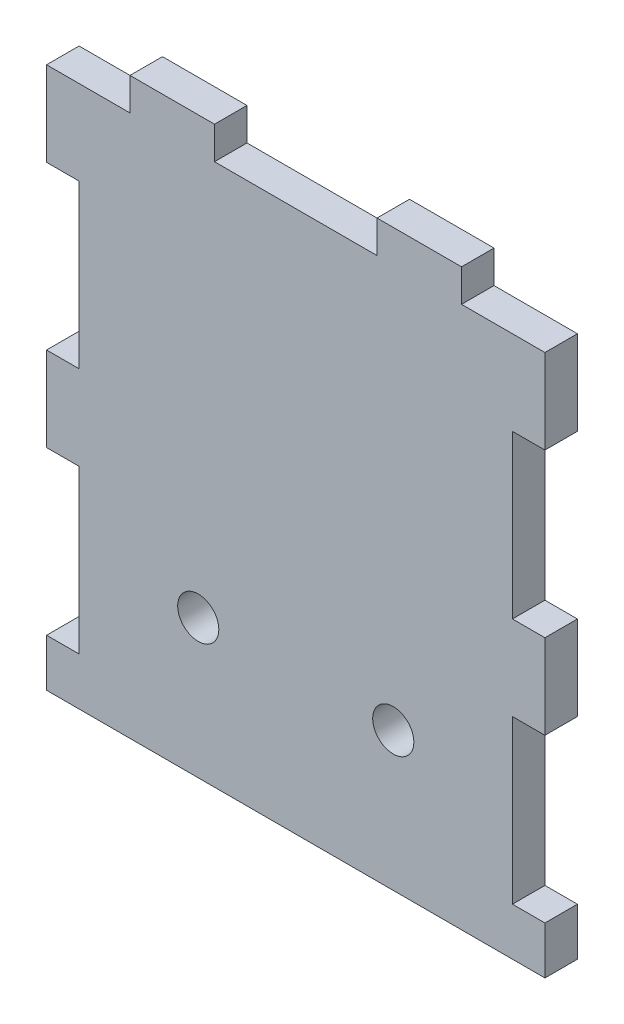
ISO-10303-21;
HEADER;
FILE_DESCRIPTION(('STEP AP214'),'2;1');
FILE_NAME('part.step','',(''),(''),'','','');
FILE_SCHEMA(('AUTOMOTIVE_DESIGN { 1 0 10303 214 1 1 1 1 }'));
ENDSEC;
DATA;
#1=APPLICATION_CONTEXT('core data for automotive mechanical design processes');
#2=APPLICATION_PROTOCOL_DEFINITION('international standard','automotive_design',2000,#1);
#3=PRODUCT_CONTEXT('',#1,'mechanical');
#4=PRODUCT('Part','Part','',(#3));
#5=PRODUCT_RELATED_PRODUCT_CATEGORY('part','',(#4));
#6=PRODUCT_DEFINITION_FORMATION('','',#4);
#7=PRODUCT_DEFINITION_CONTEXT('part definition',#1,'design');
#8=PRODUCT_DEFINITION('design','',#6,#7);
#9=PRODUCT_DEFINITION_SHAPE('','',#8);
#10=(LENGTH_UNIT() NAMED_UNIT(*) SI_UNIT(.MILLI.,.METRE.));
#11=(NAMED_UNIT(*) PLANE_ANGLE_UNIT() SI_UNIT($,.RADIAN.));
#12=(NAMED_UNIT(*) SI_UNIT($,.STERADIAN.) SOLID_ANGLE_UNIT());
#13=UNCERTAINTY_MEASURE_WITH_UNIT(LENGTH_MEASURE(1.E-05),#10,'distance_accuracy_value','');
#14=(GEOMETRIC_REPRESENTATION_CONTEXT(3) GLOBAL_UNCERTAINTY_ASSIGNED_CONTEXT((#13)) GLOBAL_UNIT_ASSIGNED_CONTEXT((#10,
#11,#12)) REPRESENTATION_CONTEXT('',''));
#15=CARTESIAN_POINT('',(0.,0.,0.));
#16=DIRECTION('',(0.,0.,1.));
#17=DIRECTION('',(1.,0.,0.));
#18=AXIS2_PLACEMENT_3D('',#15,#16,#17);
#19=CARTESIAN_POINT('',(-40.9934606481482,16.5420138888889,3.));
#20=DIRECTION('',(0.,-1.,0.));
#21=DIRECTION('',(0.,0.,-1.));
#22=AXIS2_PLACEMENT_3D('',#19,#20,#21);
#23=PLANE('',#22);
#24=DIRECTION('',(0.,0.,1.));
#25=VECTOR('',#24,1.);
#26=CARTESIAN_POINT('',(-10.4934606481481,16.5420138888889,0.));
#27=LINE('',#26,#25);
#28=CARTESIAN_POINT('',(-10.4934606481481,16.5420138888889,0.));
#29=VERTEX_POINT('',#28);
#30=CARTESIAN_POINT('',(-10.4934606481481,16.5420138888889,3.));
#31=VERTEX_POINT('',#30);
#32=EDGE_CURVE('E244',#29,#31,#27,.T.);
#33=ORIENTED_EDGE('',*,*,#32,.F.);
#34=DIRECTION('',(-1.,0.,0.));
#35=VECTOR('',#34,1.);
#36=CARTESIAN_POINT('',(-40.9934606481482,16.5420138888889,0.));
#37=LINE('',#36,#35);
#38=CARTESIAN_POINT('',(-25.4934606481481,16.5420138888889,0.));
#39=VERTEX_POINT('',#38);
#40=EDGE_CURVE('E413',#29,#39,#37,.T.);
#41=ORIENTED_EDGE('',*,*,#40,.T.);
#42=DIRECTION('',(0.,0.,-1.));
#43=VECTOR('',#42,1.);
#44=CARTESIAN_POINT('',(-25.4934606481481,16.5420138888889,0.));
#45=LINE('',#44,#43);
#46=CARTESIAN_POINT('',(-25.4934606481481,16.5420138888889,3.));
#47=VERTEX_POINT('',#46);
#48=EDGE_CURVE('E248',#47,#39,#45,.T.);
#49=ORIENTED_EDGE('',*,*,#48,.F.);
#50=DIRECTION('',(-1.,0.,0.));
#51=VECTOR('',#50,1.);
#52=CARTESIAN_POINT('',(-40.9934606481482,16.5420138888889,3.));
#53=LINE('',#52,#51);
#54=EDGE_CURVE('E50',#31,#47,#53,.T.);
#55=ORIENTED_EDGE('',*,*,#54,.F.);
#56=EDGE_LOOP('',(#33,#41,#49,#55));
#57=FACE_BOUND('',#56,.T.);
#58=ADVANCED_FACE('F35',(#57),#23,.F.);
#59=DIRECTION('',(0.,0.,-1.));
#60=VECTOR('',#59,1.);
#61=CARTESIAN_POINT('',(-2.69346064814815,16.5420138888889,0.));
#62=LINE('',#61,#60);
#63=CARTESIAN_POINT('',(-2.69346064814815,16.5420138888889,3.));
#64=VERTEX_POINT('',#63);
#65=CARTESIAN_POINT('',(-2.69346064814815,16.5420138888889,0.));
#66=VERTEX_POINT('',#65);
#67=EDGE_CURVE('E58',#64,#66,#62,.T.);
#68=ORIENTED_EDGE('',*,*,#67,.F.);
#69=CARTESIAN_POINT('',(5.00653935185185,16.5420138888889,3.));
#70=VERTEX_POINT('',#69);
#71=EDGE_CURVE('E396',#70,#64,#53,.T.);
#72=ORIENTED_EDGE('',*,*,#71,.F.);
#73=DIRECTION('',(0.,0.,-1.));
#74=VECTOR('',#73,1.);
#75=CARTESIAN_POINT('',(5.00653935185185,16.5420138888889,3.));
#76=LINE('',#75,#74);
#77=CARTESIAN_POINT('',(5.00653935185185,16.5420138888889,0.));
#78=VERTEX_POINT('',#77);
#79=EDGE_CURVE('E416',#70,#78,#76,.T.);
#80=ORIENTED_EDGE('',*,*,#79,.T.);
#81=EDGE_CURVE('E411',#78,#66,#37,.T.);
#82=ORIENTED_EDGE('',*,*,#81,.T.);
#83=EDGE_LOOP('',(#68,#72,#80,#82));
#84=FACE_BOUND('',#83,.T.);
#85=ADVANCED_FACE('F496',(#84),#23,.F.);
#86=DIRECTION('',(0.,0.,1.));
#87=VECTOR('',#86,1.);
#88=CARTESIAN_POINT('',(-33.2934606481481,16.5420138888889,0.));
#89=LINE('',#88,#87);
#90=CARTESIAN_POINT('',(-33.2934606481481,16.5420138888889,0.));
#91=VERTEX_POINT('',#90);
#92=CARTESIAN_POINT('',(-33.2934606481481,16.5420138888889,3.));
#93=VERTEX_POINT('',#92);
#94=EDGE_CURVE('E245',#91,#93,#89,.T.);
#95=ORIENTED_EDGE('',*,*,#94,.F.);
#96=CARTESIAN_POINT('',(-40.9934606481482,16.5420138888889,0.));
#97=VERTEX_POINT('',#96);
#98=EDGE_CURVE('E409',#91,#97,#37,.T.);
#99=ORIENTED_EDGE('',*,*,#98,.T.);
#100=DIRECTION('',(0.,0.,-1.));
#101=VECTOR('',#100,1.);
#102=CARTESIAN_POINT('',(-40.9934606481482,16.5420138888889,3.));
#103=LINE('',#102,#101);
#104=CARTESIAN_POINT('',(-40.9934606481482,16.5420138888889,3.));
#105=VERTEX_POINT('',#104);
#106=EDGE_CURVE('E398',#105,#97,#103,.T.);
#107=ORIENTED_EDGE('',*,*,#106,.F.);
#108=EDGE_CURVE('E394',#93,#105,#53,.T.);
#109=ORIENTED_EDGE('',*,*,#108,.F.);
#110=EDGE_LOOP('',(#95,#99,#107,#109));
#111=FACE_BOUND('',#110,.T.);
#112=ADVANCED_FACE('F469',(#111),#23,.F.);
#113=CARTESIAN_POINT('',(5.00653935185185,16.5420138888889,3.));
#114=DIRECTION('',(-1.,0.,0.));
#115=DIRECTION('',(0.,-1.,0.));
#116=AXIS2_PLACEMENT_3D('',#113,#114,#115);
#117=PLANE('',#116);
#118=DIRECTION('',(0.,1.,0.));
#119=VECTOR('',#118,1.);
#120=CARTESIAN_POINT('',(5.00653935185185,16.5420138888889,0.));
#121=LINE('',#120,#119);
#122=CARTESIAN_POINT('',(5.00653935185186,-33.4579861111111,0.));
#123=VERTEX_POINT('',#122);
#124=CARTESIAN_POINT('',(5.00653935185185,-29.0579861111111,0.));
#125=VERTEX_POINT('',#124);
#126=EDGE_CURVE('E406',#123,#125,#121,.T.);
#127=ORIENTED_EDGE('',*,*,#126,.T.);
#128=DIRECTION('',(0.,0.,1.));
#129=VECTOR('',#128,1.);
#130=CARTESIAN_POINT('',(5.00653935185185,-29.0579861111111,0.));
#131=LINE('',#130,#129);
#132=CARTESIAN_POINT('',(5.00653935185185,-29.0579861111111,3.));
#133=VERTEX_POINT('',#132);
#134=EDGE_CURVE('E295',#125,#133,#131,.T.);
#135=ORIENTED_EDGE('',*,*,#134,.T.);
#136=DIRECTION('',(0.,1.,0.));
#137=VECTOR('',#136,1.);
#138=CARTESIAN_POINT('',(5.00653935185185,16.5420138888889,3.));
#139=LINE('',#138,#137);
#140=CARTESIAN_POINT('',(5.00653935185186,-33.4579861111111,3.));
#141=VERTEX_POINT('',#140);
#142=EDGE_CURVE('E391',#141,#133,#139,.T.);
#143=ORIENTED_EDGE('',*,*,#142,.F.);
#144=DIRECTION('',(0.,0.,-1.));
#145=VECTOR('',#144,1.);
#146=CARTESIAN_POINT('',(5.00653935185186,-33.4579861111111,3.));
#147=LINE('',#146,#145);
#148=EDGE_CURVE('E43',#141,#123,#147,.T.);
#149=ORIENTED_EDGE('',*,*,#148,.T.);
#150=EDGE_LOOP('',(#127,#135,#143,#149));
#151=FACE_BOUND('',#150,.T.);
#152=ADVANCED_FACE('F423',(#151),#117,.F.);
#153=CARTESIAN_POINT('',(-40.9934606481482,16.5420138888889,3.));
#154=DIRECTION('',(1.,0.,0.));
#155=DIRECTION('',(0.,0.,-1.));
#156=AXIS2_PLACEMENT_3D('',#153,#154,#155);
#157=PLANE('',#156);
#158=DIRECTION('',(0.,-1.,0.));
#159=VECTOR('',#158,1.);
#160=CARTESIAN_POINT('',(-40.9934606481482,16.5420138888889,0.));
#161=LINE('',#160,#159);
#162=CARTESIAN_POINT('',(-40.9934606481481,-6.25798611111111,0.));
#163=VERTEX_POINT('',#162);
#164=CARTESIAN_POINT('',(-40.9934606481482,-14.0579861111111,0.));
#165=VERTEX_POINT('',#164);
#166=EDGE_CURVE('E403',#163,#165,#161,.T.);
#167=ORIENTED_EDGE('',*,*,#166,.T.);
#168=DIRECTION('',(0.,0.,1.));
#169=VECTOR('',#168,1.);
#170=CARTESIAN_POINT('',(-40.9934606481482,-14.0579861111111,0.));
#171=LINE('',#170,#169);
#172=CARTESIAN_POINT('',(-40.9934606481482,-14.0579861111111,3.));
#173=VERTEX_POINT('',#172);
#174=EDGE_CURVE('E321',#165,#173,#171,.T.);
#175=ORIENTED_EDGE('',*,*,#174,.T.);
#176=DIRECTION('',(0.,-1.,0.));
#177=VECTOR('',#176,1.);
#178=CARTESIAN_POINT('',(-40.9934606481482,16.5420138888889,3.));
#179=LINE('',#178,#177);
#180=CARTESIAN_POINT('',(-40.9934606481481,-6.25798611111111,3.));
#181=VERTEX_POINT('',#180);
#182=EDGE_CURVE('E387',#181,#173,#179,.T.);
#183=ORIENTED_EDGE('',*,*,#182,.F.);
#184=DIRECTION('',(0.,0.,1.));
#185=VECTOR('',#184,1.);
#186=CARTESIAN_POINT('',(-40.9934606481481,-6.25798611111111,0.));
#187=LINE('',#186,#185);
#188=EDGE_CURVE('E340',#163,#181,#187,.T.);
#189=ORIENTED_EDGE('',*,*,#188,.F.);
#190=EDGE_LOOP('',(#167,#175,#183,#189));
#191=FACE_BOUND('',#190,.T.);
#192=ADVANCED_FACE('F444',(#191),#157,.F.);
#193=CARTESIAN_POINT('',(-40.9934606481482,8.74201388888889,0.));
#194=VERTEX_POINT('',#193);
#195=EDGE_CURVE('E399',#97,#194,#161,.T.);
#196=ORIENTED_EDGE('',*,*,#195,.T.);
#197=DIRECTION('',(0.,0.,1.));
#198=VECTOR('',#197,1.);
#199=CARTESIAN_POINT('',(-40.9934606481482,8.74201388888889,0.));
#200=LINE('',#199,#198);
#201=CARTESIAN_POINT('',(-40.9934606481482,8.74201388888889,3.));
#202=VERTEX_POINT('',#201);
#203=EDGE_CURVE('E349',#194,#202,#200,.T.);
#204=ORIENTED_EDGE('',*,*,#203,.T.);
#205=EDGE_CURVE('E383',#105,#202,#179,.T.);
#206=ORIENTED_EDGE('',*,*,#205,.F.);
#207=ORIENTED_EDGE('',*,*,#106,.T.);
#208=EDGE_LOOP('',(#196,#204,#206,#207));
#209=FACE_BOUND('',#208,.T.);
#210=ADVANCED_FACE('F465',(#209),#157,.F.);
#211=CARTESIAN_POINT('',(5.00653935185185,-14.0579861111111,3.));
#212=VERTEX_POINT('',#211);
#213=CARTESIAN_POINT('',(5.00653935185186,-6.25798611111111,3.));
#214=VERTEX_POINT('',#213);
#215=EDGE_CURVE('E395',#212,#214,#139,.T.);
#216=ORIENTED_EDGE('',*,*,#215,.F.);
#217=DIRECTION('',(0.,0.,1.));
#218=VECTOR('',#217,1.);
#219=CARTESIAN_POINT('',(5.00653935185185,-14.0579861111111,0.));
#220=LINE('',#219,#218);
#221=CARTESIAN_POINT('',(5.00653935185185,-14.0579861111111,0.));
#222=VERTEX_POINT('',#221);
#223=EDGE_CURVE('E288',#222,#212,#220,.T.);
#224=ORIENTED_EDGE('',*,*,#223,.F.);
#225=CARTESIAN_POINT('',(5.00653935185186,-6.25798611111111,0.));
#226=VERTEX_POINT('',#225);
#227=EDGE_CURVE('E410',#222,#226,#121,.T.);
#228=ORIENTED_EDGE('',*,*,#227,.T.);
#229=DIRECTION('',(0.,0.,1.));
#230=VECTOR('',#229,1.);
#231=CARTESIAN_POINT('',(5.00653935185186,-6.25798611111111,0.));
#232=LINE('',#231,#230);
#233=EDGE_CURVE('E345',#226,#214,#232,.T.);
#234=ORIENTED_EDGE('',*,*,#233,.T.);
#235=EDGE_LOOP('',(#216,#224,#228,#234));
#236=FACE_BOUND('',#235,.T.);
#237=ADVANCED_FACE('F507',(#236),#117,.F.);
#238=CARTESIAN_POINT('',(-40.9934606481482,-29.0579861111111,3.));
#239=VERTEX_POINT('',#238);
#240=CARTESIAN_POINT('',(-40.9934606481482,-33.4579861111111,3.));
#241=VERTEX_POINT('',#240);
#242=EDGE_CURVE('E388',#239,#241,#179,.T.);
#243=ORIENTED_EDGE('',*,*,#242,.F.);
#244=DIRECTION('',(0.,0.,1.));
#245=VECTOR('',#244,1.);
#246=CARTESIAN_POINT('',(-40.9934606481482,-29.0579861111111,0.));
#247=LINE('',#246,#245);
#248=CARTESIAN_POINT('',(-40.9934606481482,-29.0579861111111,0.));
#249=VERTEX_POINT('',#248);
#250=EDGE_CURVE('E314',#249,#239,#247,.T.);
#251=ORIENTED_EDGE('',*,*,#250,.F.);
#252=CARTESIAN_POINT('',(-40.9934606481482,-33.4579861111111,0.));
#253=VERTEX_POINT('',#252);
#254=EDGE_CURVE('E352',#249,#253,#161,.T.);
#255=ORIENTED_EDGE('',*,*,#254,.T.);
#256=DIRECTION('',(0.,0.,-1.));
#257=VECTOR('',#256,1.);
#258=CARTESIAN_POINT('',(-40.9934606481482,-33.4579861111111,3.));
#259=LINE('',#258,#257);
#260=EDGE_CURVE('E11',#241,#253,#259,.T.);
#261=ORIENTED_EDGE('',*,*,#260,.F.);
#262=EDGE_LOOP('',(#243,#251,#255,#261));
#263=FACE_BOUND('',#262,.T.);
#264=ADVANCED_FACE('F37',(#263),#157,.F.);
#265=CARTESIAN_POINT('',(-40.9934606481482,-33.4579861111111,3.));
#266=DIRECTION('',(0.,1.,0.));
#267=DIRECTION('',(0.,0.,1.));
#268=AXIS2_PLACEMENT_3D('',#265,#266,#267);
#269=PLANE('',#268);
#270=DIRECTION('',(1.,0.,0.));
#271=VECTOR('',#270,1.);
#272=CARTESIAN_POINT('',(-40.9934606481482,-33.4579861111111,0.));
#273=LINE('',#272,#271);
#274=EDGE_CURVE('E402',#253,#123,#273,.T.);
#275=ORIENTED_EDGE('',*,*,#274,.T.);
#276=ORIENTED_EDGE('',*,*,#148,.F.);
#277=DIRECTION('',(1.,0.,0.));
#278=VECTOR('',#277,1.);
#279=CARTESIAN_POINT('',(-40.9934606481482,-33.4579861111111,3.));
#280=LINE('',#279,#278);
#281=EDGE_CURVE('E386',#241,#141,#280,.T.);
#282=ORIENTED_EDGE('',*,*,#281,.F.);
#283=ORIENTED_EDGE('',*,*,#260,.T.);
#284=EDGE_LOOP('',(#275,#276,#282,#283));
#285=FACE_BOUND('',#284,.T.);
#286=ADVANCED_FACE('F437',(#285),#269,.F.);
#287=CARTESIAN_POINT('',(5.00653935185186,8.74201388888887,3.));
#288=VERTEX_POINT('',#287);
#289=EDGE_CURVE('E390',#288,#70,#139,.T.);
#290=ORIENTED_EDGE('',*,*,#289,.F.);
#291=DIRECTION('',(0.,0.,1.));
#292=VECTOR('',#291,1.);
#293=CARTESIAN_POINT('',(5.00653935185186,8.74201388888887,0.));
#294=LINE('',#293,#292);
#295=CARTESIAN_POINT('',(5.00653935185186,8.74201388888887,0.));
#296=VERTEX_POINT('',#295);
#297=EDGE_CURVE('E368',#296,#288,#294,.T.);
#298=ORIENTED_EDGE('',*,*,#297,.F.);
#299=EDGE_CURVE('E405',#296,#78,#121,.T.);
#300=ORIENTED_EDGE('',*,*,#299,.T.);
#301=ORIENTED_EDGE('',*,*,#79,.F.);
#302=EDGE_LOOP('',(#290,#298,#300,#301));
#303=FACE_BOUND('',#302,.T.);
#304=ADVANCED_FACE('F508',(#303),#117,.F.);
#305=CARTESIAN_POINT('',(0.,0.,3.));
#306=DIRECTION('',(0.,0.,1.));
#307=DIRECTION('',(1.,0.,0.));
#308=AXIS2_PLACEMENT_3D('',#305,#306,#307);
#309=PLANE('',#308);
#310=CARTESIAN_POINT('',(-8.99346064815144,-20.6579861111107,3.));
#311=DIRECTION('',(0.,0.,1.));
#312=DIRECTION('',(1.,0.,0.));
#313=AXIS2_PLACEMENT_3D('',#310,#311,#312);
#314=CIRCLE('',#313,1.89864999999999);
#315=CARTESIAN_POINT('',(-7.09481064815145,-20.6579861111107,3.));
#316=VERTEX_POINT('',#315);
#317=EDGE_CURVE('E558',#316,#316,#314,.T.);
#318=ORIENTED_EDGE('',*,*,#317,.F.);
#319=EDGE_LOOP('',(#318));
#320=FACE_BOUND('',#319,.T.);
#321=CARTESIAN_POINT('',(-26.9934606481514,-20.6579861111109,3.));
#322=DIRECTION('',(0.,0.,1.));
#323=DIRECTION('',(1.,0.,0.));
#324=AXIS2_PLACEMENT_3D('',#321,#322,#323);
#325=CIRCLE('',#324,1.89864999999999);
#326=CARTESIAN_POINT('',(-25.0948106481515,-20.6579861111109,3.));
#327=VERTEX_POINT('',#326);
#328=EDGE_CURVE('E552',#327,#327,#325,.T.);
#329=ORIENTED_EDGE('',*,*,#328,.F.);
#330=EDGE_LOOP('',(#329));
#331=FACE_BOUND('',#330,.T.);
#332=DIRECTION('',(1.,0.,0.));
#333=VECTOR('',#332,1.);
#334=CARTESIAN_POINT('',(5.00653935185185,-29.0579861111111,3.));
#335=LINE('',#334,#333);
#336=CARTESIAN_POINT('',(2.00653935185185,-29.0579861111111,3.));
#337=VERTEX_POINT('',#336);
#338=EDGE_CURVE('E282',#337,#133,#335,.T.);
#339=ORIENTED_EDGE('',*,*,#338,.F.);
#340=DIRECTION('',(0.,-1.,0.));
#341=VECTOR('',#340,1.);
#342=CARTESIAN_POINT('',(2.00653935185185,-14.0579861111111,3.));
#343=LINE('',#342,#341);
#344=CARTESIAN_POINT('',(2.00653935185185,-14.0579861111111,3.));
#345=VERTEX_POINT('',#344);
#346=EDGE_CURVE('E291',#345,#337,#343,.T.);
#347=ORIENTED_EDGE('',*,*,#346,.F.);
#348=DIRECTION('',(-1.,0.,0.));
#349=VECTOR('',#348,1.);
#350=CARTESIAN_POINT('',(5.00653935185185,-14.0579861111111,3.));
#351=LINE('',#350,#349);
#352=EDGE_CURVE('E277',#212,#345,#351,.T.);
#353=ORIENTED_EDGE('',*,*,#352,.F.);
#354=ORIENTED_EDGE('',*,*,#215,.T.);
#355=DIRECTION('',(1.,0.,0.));
#356=VECTOR('',#355,1.);
#357=CARTESIAN_POINT('',(5.00653935185186,-6.25798611111111,3.));
#358=LINE('',#357,#356);
#359=CARTESIAN_POINT('',(2.00653935185186,-6.25798611111111,3.));
#360=VERTEX_POINT('',#359);
#361=EDGE_CURVE('E362',#360,#214,#358,.T.);
#362=ORIENTED_EDGE('',*,*,#361,.F.);
#363=DIRECTION('',(0.,-1.,0.));
#364=VECTOR('',#363,1.);
#365=CARTESIAN_POINT('',(2.00653935185186,8.74201388888887,3.));
#366=LINE('',#365,#364);
#367=CARTESIAN_POINT('',(2.00653935185186,8.74201388888887,3.));
#368=VERTEX_POINT('',#367);
#369=EDGE_CURVE('E371',#368,#360,#366,.T.);
#370=ORIENTED_EDGE('',*,*,#369,.F.);
#371=DIRECTION('',(-1.,0.,0.));
#372=VECTOR('',#371,1.);
#373=CARTESIAN_POINT('',(5.00653935185186,8.74201388888887,3.));
#374=LINE('',#373,#372);
#375=EDGE_CURVE('E324',#288,#368,#374,.T.);
#376=ORIENTED_EDGE('',*,*,#375,.F.);
#377=ORIENTED_EDGE('',*,*,#289,.T.);
#378=ORIENTED_EDGE('',*,*,#71,.T.);
#379=DIRECTION('',(0.,-1.,0.));
#380=VECTOR('',#379,1.);
#381=CARTESIAN_POINT('',(-2.69346064814815,19.5420138888889,3.00000000000001));
#382=LINE('',#381,#380);
#383=CARTESIAN_POINT('',(-2.69346064814815,19.5420138888889,3.00000000000001));
#384=VERTEX_POINT('',#383);
#385=EDGE_CURVE('E229',#384,#64,#382,.T.);
#386=ORIENTED_EDGE('',*,*,#385,.F.);
#387=DIRECTION('',(1.,0.,0.));
#388=VECTOR('',#387,1.);
#389=CARTESIAN_POINT('',(-10.4934606481481,19.5420138888889,3.));
#390=LINE('',#389,#388);
#391=CARTESIAN_POINT('',(-10.4934606481481,19.5420138888889,3.));
#392=VERTEX_POINT('',#391);
#393=EDGE_CURVE('E221',#392,#384,#390,.T.);
#394=ORIENTED_EDGE('',*,*,#393,.F.);
#395=DIRECTION('',(0.,-1.,0.));
#396=VECTOR('',#395,1.);
#397=CARTESIAN_POINT('',(-10.4934606481481,19.5420138888889,3.));
#398=LINE('',#397,#396);
#399=EDGE_CURVE('E226',#392,#31,#398,.T.);
#400=ORIENTED_EDGE('',*,*,#399,.T.);
#401=ORIENTED_EDGE('',*,*,#54,.T.);
#402=DIRECTION('',(0.,-1.,0.));
#403=VECTOR('',#402,1.);
#404=CARTESIAN_POINT('',(-25.4934606481481,19.5420138888889,3.00000000000001));
#405=LINE('',#404,#403);
#406=CARTESIAN_POINT('',(-25.4934606481481,19.5420138888889,3.00000000000001));
#407=VERTEX_POINT('',#406);
#408=EDGE_CURVE('E271',#407,#47,#405,.T.);
#409=ORIENTED_EDGE('',*,*,#408,.F.);
#410=DIRECTION('',(1.,0.,0.));
#411=VECTOR('',#410,1.);
#412=CARTESIAN_POINT('',(-33.2934606481481,19.5420138888889,3.));
#413=LINE('',#412,#411);
#414=CARTESIAN_POINT('',(-33.2934606481481,19.5420138888889,3.));
#415=VERTEX_POINT('',#414);
#416=EDGE_CURVE('E257',#415,#407,#413,.T.);
#417=ORIENTED_EDGE('',*,*,#416,.F.);
#418=DIRECTION('',(0.,-1.,0.));
#419=VECTOR('',#418,1.);
#420=CARTESIAN_POINT('',(-33.2934606481481,19.5420138888889,3.));
#421=LINE('',#420,#419);
#422=EDGE_CURVE('E274',#415,#93,#421,.T.);
#423=ORIENTED_EDGE('',*,*,#422,.T.);
#424=ORIENTED_EDGE('',*,*,#108,.T.);
#425=ORIENTED_EDGE('',*,*,#205,.T.);
#426=DIRECTION('',(-1.,0.,0.));
#427=VECTOR('',#426,1.);
#428=CARTESIAN_POINT('',(-40.9934606481482,8.74201388888889,3.));
#429=LINE('',#428,#427);
#430=CARTESIAN_POINT('',(-37.9934606481481,8.74201388888889,3.));
#431=VERTEX_POINT('',#430);
#432=EDGE_CURVE('E334',#431,#202,#429,.T.);
#433=ORIENTED_EDGE('',*,*,#432,.F.);
#434=DIRECTION('',(0.,1.,0.));
#435=VECTOR('',#434,1.);
#436=CARTESIAN_POINT('',(-37.9934606481481,8.74201388888889,3.));
#437=LINE('',#436,#435);
#438=CARTESIAN_POINT('',(-37.9934606481481,-6.25798611111111,3.));
#439=VERTEX_POINT('',#438);
#440=EDGE_CURVE('E344',#439,#431,#437,.T.);
#441=ORIENTED_EDGE('',*,*,#440,.F.);
#442=DIRECTION('',(1.,0.,0.));
#443=VECTOR('',#442,1.);
#444=CARTESIAN_POINT('',(-40.9934606481481,-6.25798611111111,3.));
#445=LINE('',#444,#443);
#446=EDGE_CURVE('E341',#181,#439,#445,.T.);
#447=ORIENTED_EDGE('',*,*,#446,.F.);
#448=ORIENTED_EDGE('',*,*,#182,.T.);
#449=DIRECTION('',(-1.,0.,0.));
#450=VECTOR('',#449,1.);
#451=CARTESIAN_POINT('',(-40.9934606481482,-14.0579861111111,3.));
#452=LINE('',#451,#450);
#453=CARTESIAN_POINT('',(-37.9934606481482,-14.0579861111111,3.));
#454=VERTEX_POINT('',#453);
#455=EDGE_CURVE('E308',#454,#173,#452,.T.);
#456=ORIENTED_EDGE('',*,*,#455,.F.);
#457=DIRECTION('',(0.,1.,0.));
#458=VECTOR('',#457,1.);
#459=CARTESIAN_POINT('',(-37.9934606481482,-14.0579861111111,3.));
#460=LINE('',#459,#458);
#461=CARTESIAN_POINT('',(-37.9934606481482,-29.0579861111111,3.));
#462=VERTEX_POINT('',#461);
#463=EDGE_CURVE('E317',#462,#454,#460,.T.);
#464=ORIENTED_EDGE('',*,*,#463,.F.);
#465=DIRECTION('',(1.,0.,0.));
#466=VECTOR('',#465,1.);
#467=CARTESIAN_POINT('',(-40.9934606481482,-29.0579861111111,3.));
#468=LINE('',#467,#466);
#469=EDGE_CURVE('E298',#239,#462,#468,.T.);
#470=ORIENTED_EDGE('',*,*,#469,.F.);
#471=ORIENTED_EDGE('',*,*,#242,.T.);
#472=ORIENTED_EDGE('',*,*,#281,.T.);
#473=ORIENTED_EDGE('',*,*,#142,.T.);
#474=EDGE_LOOP('',(#339,#347,#353,#354,#362,#370,#376,#377,#378,#386,#394,#400,#401,#409,#417,
#423,#424,#425,#433,#441,#447,#448,#456,#464,#470,#471,#472,#473));
#475=FACE_BOUND('',#474,.T.);
#476=ADVANCED_FACE('F224',(#320,#331,#475),#309,.T.);
#477=CARTESIAN_POINT('',(0.,0.,0.));
#478=DIRECTION('',(0.,0.,1.));
#479=DIRECTION('',(1.,0.,0.));
#480=AXIS2_PLACEMENT_3D('',#477,#478,#479);
#481=PLANE('',#480);
#482=CARTESIAN_POINT('',(-8.99346064815144,-20.6579861111107,0.));
#483=DIRECTION('',(0.,0.,1.));
#484=DIRECTION('',(1.,0.,0.));
#485=AXIS2_PLACEMENT_3D('',#482,#483,#484);
#486=CIRCLE('',#485,1.89864999999999);
#487=CARTESIAN_POINT('',(-7.09481064815145,-20.6579861111107,0.));
#488=VERTEX_POINT('',#487);
#489=EDGE_CURVE('E555',#488,#488,#486,.T.);
#490=ORIENTED_EDGE('',*,*,#489,.T.);
#491=EDGE_LOOP('',(#490));
#492=FACE_BOUND('',#491,.T.);
#493=CARTESIAN_POINT('',(-26.9934606481514,-20.6579861111109,0.));
#494=DIRECTION('',(0.,0.,1.));
#495=DIRECTION('',(1.,0.,0.));
#496=AXIS2_PLACEMENT_3D('',#493,#494,#495);
#497=CIRCLE('',#496,1.89864999999999);
#498=CARTESIAN_POINT('',(-25.0948106481515,-20.6579861111109,0.));
#499=VERTEX_POINT('',#498);
#500=EDGE_CURVE('E547',#499,#499,#497,.T.);
#501=ORIENTED_EDGE('',*,*,#500,.T.);
#502=EDGE_LOOP('',(#501));
#503=FACE_BOUND('',#502,.T.);
#504=DIRECTION('',(0.,-1.,0.));
#505=VECTOR('',#504,1.);
#506=CARTESIAN_POINT('',(2.00653935185185,-14.0579861111111,0.));
#507=LINE('',#506,#505);
#508=CARTESIAN_POINT('',(2.00653935185185,-14.0579861111111,0.));
#509=VERTEX_POINT('',#508);
#510=CARTESIAN_POINT('',(2.00653935185185,-29.0579861111111,0.));
#511=VERTEX_POINT('',#510);
#512=EDGE_CURVE('E281',#509,#511,#507,.T.);
#513=ORIENTED_EDGE('',*,*,#512,.T.);
#514=DIRECTION('',(1.,0.,0.));
#515=VECTOR('',#514,1.);
#516=CARTESIAN_POINT('',(5.00653935185185,-29.0579861111111,0.));
#517=LINE('',#516,#515);
#518=EDGE_CURVE('E285',#511,#125,#517,.T.);
#519=ORIENTED_EDGE('',*,*,#518,.T.);
#520=ORIENTED_EDGE('',*,*,#126,.F.);
#521=ORIENTED_EDGE('',*,*,#274,.F.);
#522=ORIENTED_EDGE('',*,*,#254,.F.);
#523=DIRECTION('',(1.,0.,0.));
#524=VECTOR('',#523,1.);
#525=CARTESIAN_POINT('',(-40.9934606481482,-29.0579861111111,0.));
#526=LINE('',#525,#524);
#527=CARTESIAN_POINT('',(-37.9934606481482,-29.0579861111111,0.));
#528=VERTEX_POINT('',#527);
#529=EDGE_CURVE('E304',#249,#528,#526,.T.);
#530=ORIENTED_EDGE('',*,*,#529,.T.);
#531=DIRECTION('',(0.,1.,0.));
#532=VECTOR('',#531,1.);
#533=CARTESIAN_POINT('',(-37.9934606481482,-14.0579861111111,0.));
#534=LINE('',#533,#532);
#535=CARTESIAN_POINT('',(-37.9934606481482,-14.0579861111111,0.));
#536=VERTEX_POINT('',#535);
#537=EDGE_CURVE('E307',#528,#536,#534,.T.);
#538=ORIENTED_EDGE('',*,*,#537,.T.);
#539=DIRECTION('',(-1.,0.,0.));
#540=VECTOR('',#539,1.);
#541=CARTESIAN_POINT('',(-40.9934606481482,-14.0579861111111,0.));
#542=LINE('',#541,#540);
#543=EDGE_CURVE('E311',#536,#165,#542,.T.);
#544=ORIENTED_EDGE('',*,*,#543,.T.);
#545=ORIENTED_EDGE('',*,*,#166,.F.);
#546=DIRECTION('',(1.,0.,0.));
#547=VECTOR('',#546,1.);
#548=CARTESIAN_POINT('',(-40.9934606481481,-6.25798611111111,0.));
#549=LINE('',#548,#547);
#550=CARTESIAN_POINT('',(-37.9934606481481,-6.25798611111111,0.));
#551=VERTEX_POINT('',#550);
#552=EDGE_CURVE('E330',#163,#551,#549,.T.);
#553=ORIENTED_EDGE('',*,*,#552,.T.);
#554=DIRECTION('',(0.,1.,0.));
#555=VECTOR('',#554,1.);
#556=CARTESIAN_POINT('',(-37.9934606481481,8.74201388888889,0.));
#557=LINE('',#556,#555);
#558=CARTESIAN_POINT('',(-37.9934606481481,8.74201388888889,0.));
#559=VERTEX_POINT('',#558);
#560=EDGE_CURVE('E333',#551,#559,#557,.T.);
#561=ORIENTED_EDGE('',*,*,#560,.T.);
#562=DIRECTION('',(-1.,0.,0.));
#563=VECTOR('',#562,1.);
#564=CARTESIAN_POINT('',(-40.9934606481482,8.74201388888889,0.));
#565=LINE('',#564,#563);
#566=EDGE_CURVE('E337',#559,#194,#565,.T.);
#567=ORIENTED_EDGE('',*,*,#566,.T.);
#568=ORIENTED_EDGE('',*,*,#195,.F.);
#569=ORIENTED_EDGE('',*,*,#98,.F.);
#570=DIRECTION('',(0.,-1.,0.));
#571=VECTOR('',#570,1.);
#572=CARTESIAN_POINT('',(-33.2934606481481,19.5420138888889,0.));
#573=LINE('',#572,#571);
#574=CARTESIAN_POINT('',(-33.2934606481481,19.5420138888889,0.));
#575=VERTEX_POINT('',#574);
#576=EDGE_CURVE('E262',#575,#91,#573,.T.);
#577=ORIENTED_EDGE('',*,*,#576,.F.);
#578=DIRECTION('',(-1.,0.,0.));
#579=VECTOR('',#578,1.);
#580=CARTESIAN_POINT('',(-33.2934606481481,19.5420138888889,0.));
#581=LINE('',#580,#579);
#582=CARTESIAN_POINT('',(-25.4934606481481,19.5420138888889,0.));
#583=VERTEX_POINT('',#582);
#584=EDGE_CURVE('E261',#583,#575,#581,.T.);
#585=ORIENTED_EDGE('',*,*,#584,.F.);
#586=DIRECTION('',(0.,-1.,0.));
#587=VECTOR('',#586,1.);
#588=CARTESIAN_POINT('',(-25.4934606481481,19.5420138888889,0.));
#589=LINE('',#588,#587);
#590=EDGE_CURVE('E268',#583,#39,#589,.T.);
#591=ORIENTED_EDGE('',*,*,#590,.T.);
#592=ORIENTED_EDGE('',*,*,#40,.F.);
#593=DIRECTION('',(0.,-1.,0.));
#594=VECTOR('',#593,1.);
#595=CARTESIAN_POINT('',(-10.4934606481481,19.5420138888889,0.));
#596=LINE('',#595,#594);
#597=CARTESIAN_POINT('',(-10.4934606481481,19.5420138888889,0.));
#598=VERTEX_POINT('',#597);
#599=EDGE_CURVE('E542',#598,#29,#596,.T.);
#600=ORIENTED_EDGE('',*,*,#599,.F.);
#601=DIRECTION('',(-1.,0.,0.));
#602=VECTOR('',#601,1.);
#603=CARTESIAN_POINT('',(-10.4934606481481,19.5420138888889,0.));
#604=LINE('',#603,#602);
#605=CARTESIAN_POINT('',(-2.69346064814815,19.5420138888889,0.));
#606=VERTEX_POINT('',#605);
#607=EDGE_CURVE('E238',#606,#598,#604,.T.);
#608=ORIENTED_EDGE('',*,*,#607,.F.);
#609=DIRECTION('',(0.,-1.,0.));
#610=VECTOR('',#609,1.);
#611=CARTESIAN_POINT('',(-2.69346064814815,19.5420138888889,0.));
#612=LINE('',#611,#610);
#613=EDGE_CURVE('E250',#606,#66,#612,.T.);
#614=ORIENTED_EDGE('',*,*,#613,.T.);
#615=ORIENTED_EDGE('',*,*,#81,.F.);
#616=ORIENTED_EDGE('',*,*,#299,.F.);
#617=DIRECTION('',(-1.,0.,0.));
#618=VECTOR('',#617,1.);
#619=CARTESIAN_POINT('',(5.00653935185186,8.74201388888887,0.));
#620=LINE('',#619,#618);
#621=CARTESIAN_POINT('',(2.00653935185186,8.74201388888887,0.));
#622=VERTEX_POINT('',#621);
#623=EDGE_CURVE('E358',#296,#622,#620,.T.);
#624=ORIENTED_EDGE('',*,*,#623,.T.);
#625=DIRECTION('',(0.,-1.,0.));
#626=VECTOR('',#625,1.);
#627=CARTESIAN_POINT('',(2.00653935185186,8.74201388888887,0.));
#628=LINE('',#627,#626);
#629=CARTESIAN_POINT('',(2.00653935185186,-6.25798611111111,0.));
#630=VERTEX_POINT('',#629);
#631=EDGE_CURVE('E361',#622,#630,#628,.T.);
#632=ORIENTED_EDGE('',*,*,#631,.T.);
#633=DIRECTION('',(1.,0.,0.));
#634=VECTOR('',#633,1.);
#635=CARTESIAN_POINT('',(5.00653935185186,-6.25798611111111,0.));
#636=LINE('',#635,#634);
#637=EDGE_CURVE('E365',#630,#226,#636,.T.);
#638=ORIENTED_EDGE('',*,*,#637,.T.);
#639=ORIENTED_EDGE('',*,*,#227,.F.);
#640=DIRECTION('',(-1.,0.,0.));
#641=VECTOR('',#640,1.);
#642=CARTESIAN_POINT('',(5.00653935185185,-14.0579861111111,0.));
#643=LINE('',#642,#641);
#644=EDGE_CURVE('E278',#222,#509,#643,.T.);
#645=ORIENTED_EDGE('',*,*,#644,.T.);
#646=EDGE_LOOP('',(#513,#519,#520,#521,#522,#530,#538,#544,#545,#553,#561,#567,#568,#569,#577,
#585,#591,#592,#600,#608,#614,#615,#616,#624,#632,#638,#639,#645));
#647=FACE_BOUND('',#646,.T.);
#648=ADVANCED_FACE('F428',(#492,#503,#647),#481,.F.);
#649=CARTESIAN_POINT('',(5.00653935185186,-6.25798611111111,0.));
#650=DIRECTION('',(0.,-1.,0.));
#651=DIRECTION('',(1.,0.,0.));
#652=AXIS2_PLACEMENT_3D('',#649,#650,#651);
#653=PLANE('',#652);
#654=ORIENTED_EDGE('',*,*,#361,.T.);
#655=ORIENTED_EDGE('',*,*,#233,.F.);
#656=ORIENTED_EDGE('',*,*,#637,.F.);
#657=DIRECTION('',(0.,0.,1.));
#658=VECTOR('',#657,1.);
#659=CARTESIAN_POINT('',(2.00653935185186,-6.25798611111111,0.));
#660=LINE('',#659,#658);
#661=EDGE_CURVE('E378',#630,#360,#660,.T.);
#662=ORIENTED_EDGE('',*,*,#661,.T.);
#663=EDGE_LOOP('',(#654,#655,#656,#662));
#664=FACE_BOUND('',#663,.T.);
#665=ADVANCED_FACE('F535',(#664),#653,.F.);
#666=CARTESIAN_POINT('',(2.00653935185186,8.74201388888887,0.));
#667=DIRECTION('',(-1.,0.,0.));
#668=DIRECTION('',(0.,0.,1.));
#669=AXIS2_PLACEMENT_3D('',#666,#667,#668);
#670=PLANE('',#669);
#671=ORIENTED_EDGE('',*,*,#369,.T.);
#672=ORIENTED_EDGE('',*,*,#661,.F.);
#673=ORIENTED_EDGE('',*,*,#631,.F.);
#674=DIRECTION('',(0.,0.,1.));
#675=VECTOR('',#674,1.);
#676=CARTESIAN_POINT('',(2.00653935185186,8.74201388888887,0.));
#677=LINE('',#676,#675);
#678=EDGE_CURVE('E380',#622,#368,#677,.T.);
#679=ORIENTED_EDGE('',*,*,#678,.T.);
#680=EDGE_LOOP('',(#671,#672,#673,#679));
#681=FACE_BOUND('',#680,.T.);
#682=ADVANCED_FACE('F632',(#681),#670,.F.);
#683=CARTESIAN_POINT('',(5.00653935185186,8.74201388888887,0.));
#684=DIRECTION('',(0.,1.,0.));
#685=DIRECTION('',(-1.,0.,0.));
#686=AXIS2_PLACEMENT_3D('',#683,#684,#685);
#687=PLANE('',#686);
#688=ORIENTED_EDGE('',*,*,#375,.T.);
#689=ORIENTED_EDGE('',*,*,#678,.F.);
#690=ORIENTED_EDGE('',*,*,#623,.F.);
#691=ORIENTED_EDGE('',*,*,#297,.T.);
#692=EDGE_LOOP('',(#688,#689,#690,#691));
#693=FACE_BOUND('',#692,.T.);
#694=ADVANCED_FACE('F639',(#693),#687,.F.);
#695=CARTESIAN_POINT('',(-40.9934606481482,8.74201388888889,0.));
#696=DIRECTION('',(0.,1.,0.));
#697=DIRECTION('',(0.,0.,1.));
#698=AXIS2_PLACEMENT_3D('',#695,#696,#697);
#699=PLANE('',#698);
#700=ORIENTED_EDGE('',*,*,#432,.T.);
#701=ORIENTED_EDGE('',*,*,#203,.F.);
#702=ORIENTED_EDGE('',*,*,#566,.F.);
#703=DIRECTION('',(0.,0.,1.));
#704=VECTOR('',#703,1.);
#705=CARTESIAN_POINT('',(-37.9934606481481,8.74201388888889,0.));
#706=LINE('',#705,#704);
#707=EDGE_CURVE('E353',#559,#431,#706,.T.);
#708=ORIENTED_EDGE('',*,*,#707,.T.);
#709=EDGE_LOOP('',(#700,#701,#702,#708));
#710=FACE_BOUND('',#709,.T.);
#711=ADVANCED_FACE('F647',(#710),#699,.F.);
#712=CARTESIAN_POINT('',(-37.9934606481481,8.74201388888889,0.));
#713=DIRECTION('',(1.,0.,0.));
#714=DIRECTION('',(0.,0.,-1.));
#715=AXIS2_PLACEMENT_3D('',#712,#713,#714);
#716=PLANE('',#715);
#717=ORIENTED_EDGE('',*,*,#440,.T.);
#718=ORIENTED_EDGE('',*,*,#707,.F.);
#719=ORIENTED_EDGE('',*,*,#560,.F.);
#720=DIRECTION('',(0.,0.,1.));
#721=VECTOR('',#720,1.);
#722=CARTESIAN_POINT('',(-37.9934606481481,-6.25798611111111,0.));
#723=LINE('',#722,#721);
#724=EDGE_CURVE('E355',#551,#439,#723,.T.);
#725=ORIENTED_EDGE('',*,*,#724,.T.);
#726=EDGE_LOOP('',(#717,#718,#719,#725));
#727=FACE_BOUND('',#726,.T.);
#728=ADVANCED_FACE('F459',(#727),#716,.F.);
#729=CARTESIAN_POINT('',(-40.9934606481481,-6.25798611111111,0.));
#730=DIRECTION('',(0.,-1.,0.));
#731=DIRECTION('',(1.,0.,0.));
#732=AXIS2_PLACEMENT_3D('',#729,#730,#731);
#733=PLANE('',#732);
#734=ORIENTED_EDGE('',*,*,#446,.T.);
#735=ORIENTED_EDGE('',*,*,#724,.F.);
#736=ORIENTED_EDGE('',*,*,#552,.F.);
#737=ORIENTED_EDGE('',*,*,#188,.T.);
#738=EDGE_LOOP('',(#734,#735,#736,#737));
#739=FACE_BOUND('',#738,.T.);
#740=ADVANCED_FACE('F457',(#739),#733,.F.);
#741=CARTESIAN_POINT('',(-40.9934606481482,-14.0579861111111,0.));
#742=DIRECTION('',(0.,1.,0.));
#743=DIRECTION('',(0.,0.,1.));
#744=AXIS2_PLACEMENT_3D('',#741,#742,#743);
#745=PLANE('',#744);
#746=ORIENTED_EDGE('',*,*,#455,.T.);
#747=ORIENTED_EDGE('',*,*,#174,.F.);
#748=ORIENTED_EDGE('',*,*,#543,.F.);
#749=DIRECTION('',(0.,0.,1.));
#750=VECTOR('',#749,1.);
#751=CARTESIAN_POINT('',(-37.9934606481482,-14.0579861111111,0.));
#752=LINE('',#751,#750);
#753=EDGE_CURVE('E325',#536,#454,#752,.T.);
#754=ORIENTED_EDGE('',*,*,#753,.T.);
#755=EDGE_LOOP('',(#746,#747,#748,#754));
#756=FACE_BOUND('',#755,.T.);
#757=ADVANCED_FACE('F449',(#756),#745,.F.);
#758=CARTESIAN_POINT('',(-37.9934606481482,-14.0579861111111,0.));
#759=DIRECTION('',(1.,0.,0.));
#760=DIRECTION('',(0.,0.,-1.));
#761=AXIS2_PLACEMENT_3D('',#758,#759,#760);
#762=PLANE('',#761);
#763=ORIENTED_EDGE('',*,*,#463,.T.);
#764=ORIENTED_EDGE('',*,*,#753,.F.);
#765=ORIENTED_EDGE('',*,*,#537,.F.);
#766=DIRECTION('',(0.,0.,1.));
#767=VECTOR('',#766,1.);
#768=CARTESIAN_POINT('',(-37.9934606481482,-29.0579861111111,0.));
#769=LINE('',#768,#767);
#770=EDGE_CURVE('E327',#528,#462,#769,.T.);
#771=ORIENTED_EDGE('',*,*,#770,.T.);
#772=EDGE_LOOP('',(#763,#764,#765,#771));
#773=FACE_BOUND('',#772,.T.);
#774=ADVANCED_FACE('F673',(#773),#762,.F.);
#775=CARTESIAN_POINT('',(-40.9934606481482,-29.0579861111111,0.));
#776=DIRECTION('',(0.,-1.,0.));
#777=DIRECTION('',(1.,0.,0.));
#778=AXIS2_PLACEMENT_3D('',#775,#776,#777);
#779=PLANE('',#778);
#780=ORIENTED_EDGE('',*,*,#469,.T.);
#781=ORIENTED_EDGE('',*,*,#770,.F.);
#782=ORIENTED_EDGE('',*,*,#529,.F.);
#783=ORIENTED_EDGE('',*,*,#250,.T.);
#784=EDGE_LOOP('',(#780,#781,#782,#783));
#785=FACE_BOUND('',#784,.T.);
#786=ADVANCED_FACE('F681',(#785),#779,.F.);
#787=CARTESIAN_POINT('',(5.00653935185185,-29.0579861111111,0.));
#788=DIRECTION('',(0.,-1.,0.));
#789=DIRECTION('',(1.,0.,0.));
#790=AXIS2_PLACEMENT_3D('',#787,#788,#789);
#791=PLANE('',#790);
#792=ORIENTED_EDGE('',*,*,#338,.T.);
#793=ORIENTED_EDGE('',*,*,#134,.F.);
#794=ORIENTED_EDGE('',*,*,#518,.F.);
#795=DIRECTION('',(0.,0.,1.));
#796=VECTOR('',#795,1.);
#797=CARTESIAN_POINT('',(2.00653935185185,-29.0579861111111,0.));
#798=LINE('',#797,#796);
#799=EDGE_CURVE('E299',#511,#337,#798,.T.);
#800=ORIENTED_EDGE('',*,*,#799,.T.);
#801=EDGE_LOOP('',(#792,#793,#794,#800));
#802=FACE_BOUND('',#801,.T.);
#803=ADVANCED_FACE('F432',(#802),#791,.F.);
#804=CARTESIAN_POINT('',(2.00653935185185,-14.0579861111111,0.));
#805=DIRECTION('',(-1.,0.,0.));
#806=DIRECTION('',(0.,0.,1.));
#807=AXIS2_PLACEMENT_3D('',#804,#805,#806);
#808=PLANE('',#807);
#809=ORIENTED_EDGE('',*,*,#346,.T.);
#810=ORIENTED_EDGE('',*,*,#799,.F.);
#811=ORIENTED_EDGE('',*,*,#512,.F.);
#812=DIRECTION('',(0.,0.,1.));
#813=VECTOR('',#812,1.);
#814=CARTESIAN_POINT('',(2.00653935185185,-14.0579861111111,0.));
#815=LINE('',#814,#813);
#816=EDGE_CURVE('E301',#509,#345,#815,.T.);
#817=ORIENTED_EDGE('',*,*,#816,.T.);
#818=EDGE_LOOP('',(#809,#810,#811,#817));
#819=FACE_BOUND('',#818,.T.);
#820=ADVANCED_FACE('F491',(#819),#808,.F.);
#821=CARTESIAN_POINT('',(5.00653935185185,-14.0579861111111,0.));
#822=DIRECTION('',(0.,1.,0.));
#823=DIRECTION('',(-1.,0.,0.));
#824=AXIS2_PLACEMENT_3D('',#821,#822,#823);
#825=PLANE('',#824);
#826=ORIENTED_EDGE('',*,*,#352,.T.);
#827=ORIENTED_EDGE('',*,*,#816,.F.);
#828=ORIENTED_EDGE('',*,*,#644,.F.);
#829=ORIENTED_EDGE('',*,*,#223,.T.);
#830=EDGE_LOOP('',(#826,#827,#828,#829));
#831=FACE_BOUND('',#830,.T.);
#832=ADVANCED_FACE('F484',(#831),#825,.F.);
#833=CARTESIAN_POINT('',(-33.2934606481481,19.5420138888889,0.));
#834=DIRECTION('',(1.,0.,0.));
#835=DIRECTION('',(0.,0.,-1.));
#836=AXIS2_PLACEMENT_3D('',#833,#834,#835);
#837=PLANE('',#836);
#838=ORIENTED_EDGE('',*,*,#94,.T.);
#839=ORIENTED_EDGE('',*,*,#422,.F.);
#840=DIRECTION('',(0.,0.,1.));
#841=VECTOR('',#840,1.);
#842=CARTESIAN_POINT('',(-33.2934606481481,19.5420138888889,0.));
#843=LINE('',#842,#841);
#844=EDGE_CURVE('E254',#575,#415,#843,.T.);
#845=ORIENTED_EDGE('',*,*,#844,.F.);
#846=ORIENTED_EDGE('',*,*,#576,.T.);
#847=EDGE_LOOP('',(#838,#839,#845,#846));
#848=FACE_BOUND('',#847,.T.);
#849=ADVANCED_FACE('F482',(#848),#837,.F.);
#850=CARTESIAN_POINT('',(-25.4934606481481,19.5420138888889,0.));
#851=DIRECTION('',(-1.,0.,0.));
#852=DIRECTION('',(0.,0.,1.));
#853=AXIS2_PLACEMENT_3D('',#850,#851,#852);
#854=PLANE('',#853);
#855=ORIENTED_EDGE('',*,*,#48,.T.);
#856=ORIENTED_EDGE('',*,*,#590,.F.);
#857=DIRECTION('',(0.,0.,-1.));
#858=VECTOR('',#857,1.);
#859=CARTESIAN_POINT('',(-25.4934606481481,19.5420138888889,0.));
#860=LINE('',#859,#858);
#861=EDGE_CURVE('E259',#407,#583,#860,.T.);
#862=ORIENTED_EDGE('',*,*,#861,.F.);
#863=ORIENTED_EDGE('',*,*,#408,.T.);
#864=EDGE_LOOP('',(#855,#856,#862,#863));
#865=FACE_BOUND('',#864,.T.);
#866=ADVANCED_FACE('F473',(#865),#854,.F.);
#867=CARTESIAN_POINT('',(0.,19.5420138888889,0.));
#868=DIRECTION('',(0.,1.,0.));
#869=DIRECTION('',(0.,0.,1.));
#870=AXIS2_PLACEMENT_3D('',#867,#868,#869);
#871=PLANE('',#870);
#872=ORIENTED_EDGE('',*,*,#844,.T.);
#873=ORIENTED_EDGE('',*,*,#416,.T.);
#874=ORIENTED_EDGE('',*,*,#861,.T.);
#875=ORIENTED_EDGE('',*,*,#584,.T.);
#876=EDGE_LOOP('',(#872,#873,#874,#875));
#877=FACE_BOUND('',#876,.T.);
#878=ADVANCED_FACE('F479',(#877),#871,.T.);
#879=CARTESIAN_POINT('',(-10.4934606481481,19.5420138888889,0.));
#880=DIRECTION('',(1.,0.,0.));
#881=DIRECTION('',(0.,0.,-1.));
#882=AXIS2_PLACEMENT_3D('',#879,#880,#881);
#883=PLANE('',#882);
#884=ORIENTED_EDGE('',*,*,#32,.T.);
#885=ORIENTED_EDGE('',*,*,#399,.F.);
#886=DIRECTION('',(0.,0.,1.));
#887=VECTOR('',#886,1.);
#888=CARTESIAN_POINT('',(-10.4934606481481,19.5420138888889,0.));
#889=LINE('',#888,#887);
#890=EDGE_CURVE('E233',#598,#392,#889,.T.);
#891=ORIENTED_EDGE('',*,*,#890,.F.);
#892=ORIENTED_EDGE('',*,*,#599,.T.);
#893=EDGE_LOOP('',(#884,#885,#891,#892));
#894=FACE_BOUND('',#893,.T.);
#895=ADVANCED_FACE('F243',(#894),#883,.F.);
#896=CARTESIAN_POINT('',(-2.69346064814815,19.5420138888889,0.));
#897=DIRECTION('',(-1.,0.,0.));
#898=DIRECTION('',(0.,0.,1.));
#899=AXIS2_PLACEMENT_3D('',#896,#897,#898);
#900=PLANE('',#899);
#901=ORIENTED_EDGE('',*,*,#67,.T.);
#902=ORIENTED_EDGE('',*,*,#613,.F.);
#903=DIRECTION('',(0.,0.,-1.));
#904=VECTOR('',#903,1.);
#905=CARTESIAN_POINT('',(-2.69346064814815,19.5420138888889,0.));
#906=LINE('',#905,#904);
#907=EDGE_CURVE('E232',#384,#606,#906,.T.);
#908=ORIENTED_EDGE('',*,*,#907,.F.);
#909=ORIENTED_EDGE('',*,*,#385,.T.);
#910=EDGE_LOOP('',(#901,#902,#908,#909));
#911=FACE_BOUND('',#910,.T.);
#912=ADVANCED_FACE('F576',(#911),#900,.F.);
#913=CARTESIAN_POINT('',(22.8,19.5420138888889,0.));
#914=DIRECTION('',(0.,1.,0.));
#915=DIRECTION('',(0.,0.,1.));
#916=AXIS2_PLACEMENT_3D('',#913,#914,#915);
#917=PLANE('',#916);
#918=ORIENTED_EDGE('',*,*,#890,.T.);
#919=ORIENTED_EDGE('',*,*,#393,.T.);
#920=ORIENTED_EDGE('',*,*,#907,.T.);
#921=ORIENTED_EDGE('',*,*,#607,.T.);
#922=EDGE_LOOP('',(#918,#919,#920,#921));
#923=FACE_BOUND('',#922,.T.);
#924=ADVANCED_FACE('F236',(#923),#917,.T.);
#925=CARTESIAN_POINT('',(-26.9934606481514,-20.6579861111109,3.));
#926=DIRECTION('',(0.,0.,1.));
#927=DIRECTION('',(1.,0.,0.));
#928=AXIS2_PLACEMENT_3D('',#925,#926,#927);
#929=CYLINDRICAL_SURFACE('',#928,1.89864999999999);
#930=ORIENTED_EDGE('',*,*,#500,.F.);
#931=EDGE_LOOP('',(#930));
#932=FACE_BOUND('',#931,.T.);
#933=ORIENTED_EDGE('',*,*,#328,.T.);
#934=EDGE_LOOP('',(#933));
#935=FACE_BOUND('',#934,.T.);
#936=ADVANCED_FACE('F566',(#932,#935),#929,.F.);
#937=CARTESIAN_POINT('',(-8.99346064815144,-20.6579861111107,3.));
#938=DIRECTION('',(0.,0.,1.));
#939=DIRECTION('',(1.,0.,0.));
#940=AXIS2_PLACEMENT_3D('',#937,#938,#939);
#941=CYLINDRICAL_SURFACE('',#940,1.89864999999999);
#942=ORIENTED_EDGE('',*,*,#489,.F.);
#943=EDGE_LOOP('',(#942));
#944=FACE_BOUND('',#943,.T.);
#945=ORIENTED_EDGE('',*,*,#317,.T.);
#946=EDGE_LOOP('',(#945));
#947=FACE_BOUND('',#946,.T.);
#948=ADVANCED_FACE('F562',(#944,#947),#941,.F.);
#949=CLOSED_SHELL('',(#58,#85,#112,#152,#192,#210,#237,#264,#286,#304,#476,#648,#665,#682,#694,
#711,#728,#740,#757,#774,#786,#803,#820,#832,#849,#866,#878,#895,#912,#924,#936,#948));
#950=MANIFOLD_SOLID_BREP('B2',#949);
#951=ADVANCED_BREP_SHAPE_REPRESENTATION('',(#18,#950),#14);
#952=SHAPE_DEFINITION_REPRESENTATION(#9,#951);
ENDSEC;
END-ISO-10303-21;
